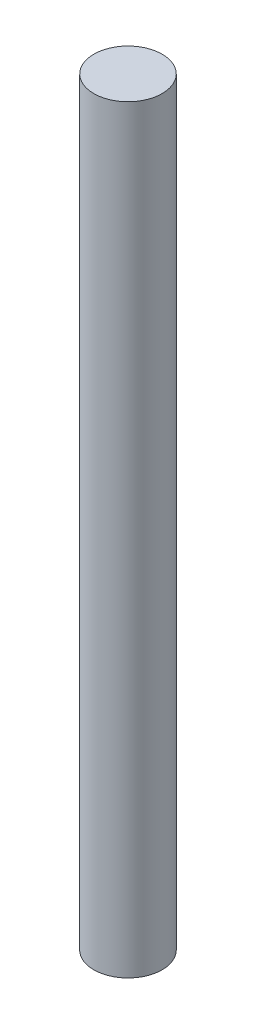
ISO-10303-21;
HEADER;
FILE_DESCRIPTION(('STEP AP214'),'2;1');
FILE_NAME('part.step','',(''),(''),'','','');
FILE_SCHEMA(('AUTOMOTIVE_DESIGN { 1 0 10303 214 1 1 1 1 }'));
ENDSEC;
DATA;
#1=APPLICATION_CONTEXT('core data for automotive mechanical design processes');
#2=APPLICATION_PROTOCOL_DEFINITION('international standard','automotive_design',2000,#1);
#3=PRODUCT_CONTEXT('',#1,'mechanical');
#4=PRODUCT('Part','Part','',(#3));
#5=PRODUCT_RELATED_PRODUCT_CATEGORY('part','',(#4));
#6=PRODUCT_DEFINITION_FORMATION('','',#4);
#7=PRODUCT_DEFINITION_CONTEXT('part definition',#1,'design');
#8=PRODUCT_DEFINITION('design','',#6,#7);
#9=PRODUCT_DEFINITION_SHAPE('','',#8);
#10=(LENGTH_UNIT() NAMED_UNIT(*) SI_UNIT(.MILLI.,.METRE.));
#11=(NAMED_UNIT(*) PLANE_ANGLE_UNIT() SI_UNIT($,.RADIAN.));
#12=(NAMED_UNIT(*) SI_UNIT($,.STERADIAN.) SOLID_ANGLE_UNIT());
#13=UNCERTAINTY_MEASURE_WITH_UNIT(LENGTH_MEASURE(1.E-05),#10,'distance_accuracy_value','');
#14=(GEOMETRIC_REPRESENTATION_CONTEXT(3) GLOBAL_UNCERTAINTY_ASSIGNED_CONTEXT((#13)) GLOBAL_UNIT_ASSIGNED_CONTEXT((#10,
#11,#12)) REPRESENTATION_CONTEXT('',''));
#15=CARTESIAN_POINT('',(0.,0.,0.));
#16=DIRECTION('',(0.,0.,1.));
#17=DIRECTION('',(1.,0.,0.));
#18=AXIS2_PLACEMENT_3D('',#15,#16,#17);
#19=CARTESIAN_POINT('',(0.,50.,0.));
#20=DIRECTION('',(0.,-1.,0.));
#21=DIRECTION('',(0.,0.,-1.));
#22=AXIS2_PLACEMENT_3D('',#19,#20,#21);
#23=CYLINDRICAL_SURFACE('',#22,2.25);
#24=CARTESIAN_POINT('',(0.,50.,0.));
#25=DIRECTION('',(0.,1.,0.));
#26=DIRECTION('',(0.,0.,1.));
#27=AXIS2_PLACEMENT_3D('',#24,#25,#26);
#28=CIRCLE('',#27,2.25);
#29=CARTESIAN_POINT('',(0.,50.,2.25));
#30=VERTEX_POINT('',#29);
#31=EDGE_CURVE('E10',#30,#30,#28,.T.);
#32=ORIENTED_EDGE('',*,*,#31,.F.);
#33=EDGE_LOOP('',(#32));
#34=FACE_BOUND('',#33,.T.);
#35=CARTESIAN_POINT('',(0.,0.,0.));
#36=DIRECTION('',(0.,1.,0.));
#37=DIRECTION('',(0.,0.,1.));
#38=AXIS2_PLACEMENT_3D('',#35,#36,#37);
#39=CIRCLE('',#38,2.25);
#40=CARTESIAN_POINT('',(0.,0.,2.25));
#41=VERTEX_POINT('',#40);
#42=EDGE_CURVE('E38',#41,#41,#39,.T.);
#43=ORIENTED_EDGE('',*,*,#42,.T.);
#44=EDGE_LOOP('',(#43));
#45=FACE_BOUND('',#44,.T.);
#46=ADVANCED_FACE('F35',(#34,#45),#23,.T.);
#47=CARTESIAN_POINT('',(0.,50.,0.));
#48=DIRECTION('',(0.,1.,0.));
#49=DIRECTION('',(0.,0.,1.));
#50=AXIS2_PLACEMENT_3D('',#47,#48,#49);
#51=PLANE('',#50);
#52=ORIENTED_EDGE('',*,*,#31,.T.);
#53=EDGE_LOOP('',(#52));
#54=FACE_BOUND('',#53,.T.);
#55=ADVANCED_FACE('F50',(#54),#51,.T.);
#56=CARTESIAN_POINT('',(0.,0.,0.));
#57=DIRECTION('',(0.,1.,0.));
#58=DIRECTION('',(0.,0.,1.));
#59=AXIS2_PLACEMENT_3D('',#56,#57,#58);
#60=PLANE('',#59);
#61=ORIENTED_EDGE('',*,*,#42,.F.);
#62=EDGE_LOOP('',(#61));
#63=FACE_BOUND('',#62,.T.);
#64=ADVANCED_FACE('F48',(#63),#60,.F.);
#65=CLOSED_SHELL('',(#46,#55,#64));
#66=MANIFOLD_SOLID_BREP('B2',#65);
#67=ADVANCED_BREP_SHAPE_REPRESENTATION('',(#18,#66),#14);
#68=SHAPE_DEFINITION_REPRESENTATION(#9,#67);
ENDSEC;
END-ISO-10303-21;
